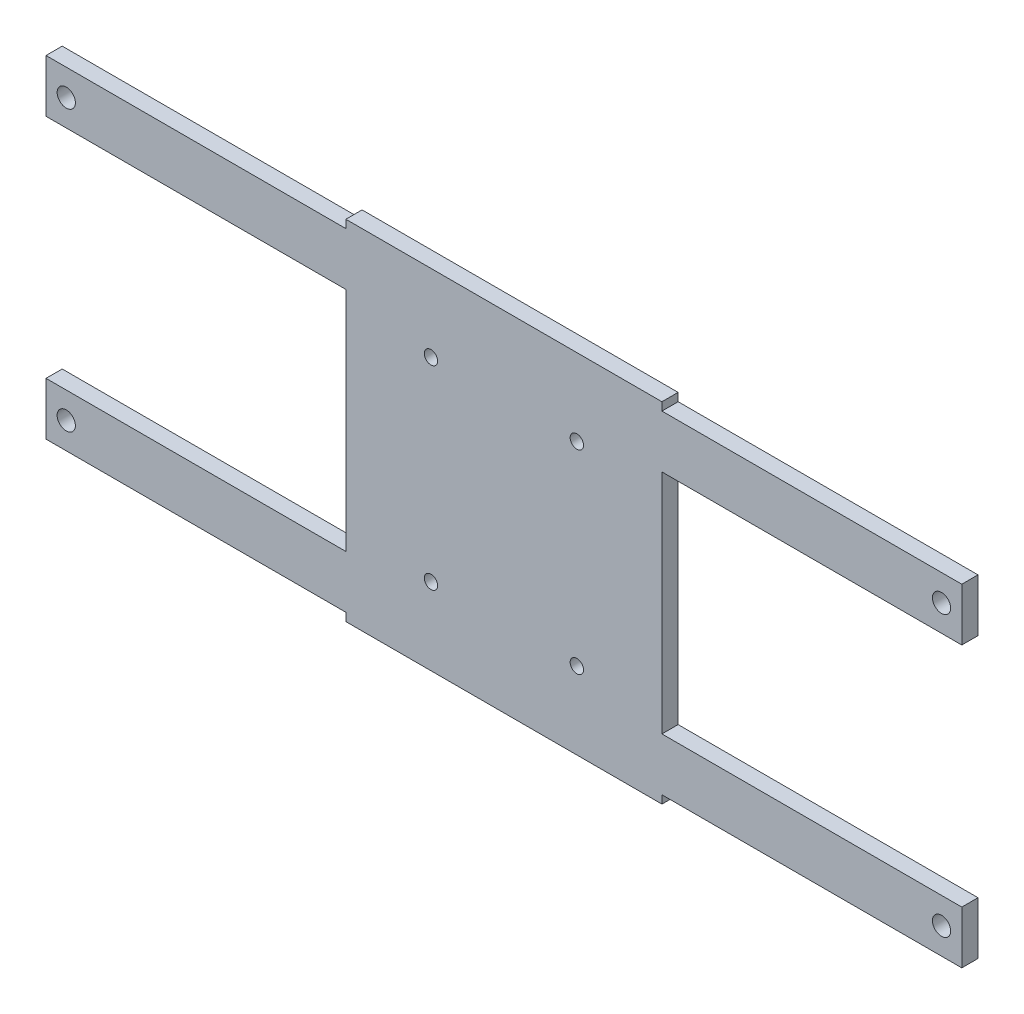
ISO-10303-21;
HEADER;
FILE_DESCRIPTION(('STEP AP214'),'2;1');
FILE_NAME('part.step','',(''),(''),'','','');
FILE_SCHEMA(('AUTOMOTIVE_DESIGN { 1 0 10303 214 1 1 1 1 }'));
ENDSEC;
DATA;
#1=APPLICATION_CONTEXT('core data for automotive mechanical design processes');
#2=APPLICATION_PROTOCOL_DEFINITION('international standard','automotive_design',2000,#1);
#3=PRODUCT_CONTEXT('',#1,'mechanical');
#4=PRODUCT('Part','Part','',(#3));
#5=PRODUCT_RELATED_PRODUCT_CATEGORY('part','',(#4));
#6=PRODUCT_DEFINITION_FORMATION('','',#4);
#7=PRODUCT_DEFINITION_CONTEXT('part definition',#1,'design');
#8=PRODUCT_DEFINITION('design','',#6,#7);
#9=PRODUCT_DEFINITION_SHAPE('','',#8);
#10=(LENGTH_UNIT() NAMED_UNIT(*) SI_UNIT(.MILLI.,.METRE.));
#11=(NAMED_UNIT(*) PLANE_ANGLE_UNIT() SI_UNIT($,.RADIAN.));
#12=(NAMED_UNIT(*) SI_UNIT($,.STERADIAN.) SOLID_ANGLE_UNIT());
#13=UNCERTAINTY_MEASURE_WITH_UNIT(LENGTH_MEASURE(1.E-05),#10,'distance_accuracy_value','');
#14=(GEOMETRIC_REPRESENTATION_CONTEXT(3) GLOBAL_UNCERTAINTY_ASSIGNED_CONTEXT((#13)) GLOBAL_UNIT_ASSIGNED_CONTEXT((#10,
#11,#12)) REPRESENTATION_CONTEXT('',''));
#15=CARTESIAN_POINT('',(0.,0.,0.));
#16=DIRECTION('',(0.,0.,1.));
#17=DIRECTION('',(1.,0.,0.));
#18=AXIS2_PLACEMENT_3D('',#15,#16,#17);
#19=CARTESIAN_POINT('',(39.,-28.,4.));
#20=DIRECTION('',(0.,-1.,0.));
#21=DIRECTION('',(0.,0.,-1.));
#22=AXIS2_PLACEMENT_3D('',#19,#20,#21);
#23=PLANE('',#22);
#24=DIRECTION('',(-1.,0.,0.));
#25=VECTOR('',#24,1.);
#26=CARTESIAN_POINT('',(39.,-28.,0.));
#27=LINE('',#26,#25);
#28=CARTESIAN_POINT('',(113.,-28.,0.));
#29=VERTEX_POINT('',#28);
#30=CARTESIAN_POINT('',(39.,-28.,0.));
#31=VERTEX_POINT('',#30);
#32=EDGE_CURVE('E213',#29,#31,#27,.T.);
#33=ORIENTED_EDGE('',*,*,#32,.T.);
#34=DIRECTION('',(0.,0.,-1.));
#35=VECTOR('',#34,1.);
#36=CARTESIAN_POINT('',(39.,-28.,4.));
#37=LINE('',#36,#35);
#38=CARTESIAN_POINT('',(39.,-28.,4.));
#39=VERTEX_POINT('',#38);
#40=EDGE_CURVE('E11',#39,#31,#37,.T.);
#41=ORIENTED_EDGE('',*,*,#40,.F.);
#42=DIRECTION('',(-1.,0.,0.));
#43=VECTOR('',#42,1.);
#44=CARTESIAN_POINT('',(39.,-28.,4.));
#45=LINE('',#44,#43);
#46=CARTESIAN_POINT('',(113.,-28.,4.));
#47=VERTEX_POINT('',#46);
#48=EDGE_CURVE('E252',#47,#39,#45,.T.);
#49=ORIENTED_EDGE('',*,*,#48,.F.);
#50=DIRECTION('',(0.,0.,-1.));
#51=VECTOR('',#50,1.);
#52=CARTESIAN_POINT('',(113.,-28.,4.));
#53=LINE('',#52,#51);
#54=EDGE_CURVE('E209',#47,#29,#53,.T.);
#55=ORIENTED_EDGE('',*,*,#54,.T.);
#56=EDGE_LOOP('',(#33,#41,#49,#55));
#57=FACE_BOUND('',#56,.T.);
#58=ADVANCED_FACE('F43',(#57),#23,.F.);
#59=CARTESIAN_POINT('',(39.,28.,4.));
#60=DIRECTION('',(-1.,0.,0.));
#61=DIRECTION('',(0.,0.,1.));
#62=AXIS2_PLACEMENT_3D('',#59,#60,#61);
#63=PLANE('',#62);
#64=DIRECTION('',(0.,1.,0.));
#65=VECTOR('',#64,1.);
#66=CARTESIAN_POINT('',(39.,28.,0.));
#67=LINE('',#66,#65);
#68=CARTESIAN_POINT('',(39.,28.,0.));
#69=VERTEX_POINT('',#68);
#70=EDGE_CURVE('E216',#31,#69,#67,.T.);
#71=ORIENTED_EDGE('',*,*,#70,.T.);
#72=DIRECTION('',(0.,0.,-1.));
#73=VECTOR('',#72,1.);
#74=CARTESIAN_POINT('',(39.,28.,4.));
#75=LINE('',#74,#73);
#76=CARTESIAN_POINT('',(39.,28.,4.));
#77=VERTEX_POINT('',#76);
#78=EDGE_CURVE('E52',#77,#69,#75,.T.);
#79=ORIENTED_EDGE('',*,*,#78,.F.);
#80=DIRECTION('',(0.,1.,0.));
#81=VECTOR('',#80,1.);
#82=CARTESIAN_POINT('',(39.,28.,4.));
#83=LINE('',#82,#81);
#84=EDGE_CURVE('E140',#39,#77,#83,.T.);
#85=ORIENTED_EDGE('',*,*,#84,.F.);
#86=ORIENTED_EDGE('',*,*,#40,.T.);
#87=EDGE_LOOP('',(#71,#79,#85,#86));
#88=FACE_BOUND('',#87,.T.);
#89=ADVANCED_FACE('F405',(#88),#63,.F.);
#90=CARTESIAN_POINT('',(113.,28.,4.));
#91=DIRECTION('',(0.,1.,0.));
#92=DIRECTION('',(0.,0.,1.));
#93=AXIS2_PLACEMENT_3D('',#90,#91,#92);
#94=PLANE('',#93);
#95=DIRECTION('',(1.,0.,0.));
#96=VECTOR('',#95,1.);
#97=CARTESIAN_POINT('',(113.,28.,0.));
#98=LINE('',#97,#96);
#99=CARTESIAN_POINT('',(113.,28.,0.));
#100=VERTEX_POINT('',#99);
#101=EDGE_CURVE('E219',#69,#100,#98,.T.);
#102=ORIENTED_EDGE('',*,*,#101,.T.);
#103=DIRECTION('',(0.,0.,-1.));
#104=VECTOR('',#103,1.);
#105=CARTESIAN_POINT('',(113.,28.,4.));
#106=LINE('',#105,#104);
#107=CARTESIAN_POINT('',(113.,28.,4.));
#108=VERTEX_POINT('',#107);
#109=EDGE_CURVE('E295',#108,#100,#106,.T.);
#110=ORIENTED_EDGE('',*,*,#109,.F.);
#111=DIRECTION('',(1.,0.,0.));
#112=VECTOR('',#111,1.);
#113=CARTESIAN_POINT('',(113.,28.,4.));
#114=LINE('',#113,#112);
#115=EDGE_CURVE('E348',#77,#108,#114,.T.);
#116=ORIENTED_EDGE('',*,*,#115,.F.);
#117=ORIENTED_EDGE('',*,*,#78,.T.);
#118=EDGE_LOOP('',(#102,#110,#116,#117));
#119=FACE_BOUND('',#118,.T.);
#120=ADVANCED_FACE('F409',(#119),#94,.F.);
#121=CARTESIAN_POINT('',(113.,41.,4.));
#122=DIRECTION('',(-1.,0.,0.));
#123=DIRECTION('',(0.,0.,1.));
#124=AXIS2_PLACEMENT_3D('',#121,#122,#123);
#125=PLANE('',#124);
#126=DIRECTION('',(0.,1.,0.));
#127=VECTOR('',#126,1.);
#128=CARTESIAN_POINT('',(113.,41.,0.));
#129=LINE('',#128,#127);
#130=CARTESIAN_POINT('',(113.,41.,0.));
#131=VERTEX_POINT('',#130);
#132=EDGE_CURVE('E221',#100,#131,#129,.T.);
#133=ORIENTED_EDGE('',*,*,#132,.T.);
#134=DIRECTION('',(0.,0.,-1.));
#135=VECTOR('',#134,1.);
#136=CARTESIAN_POINT('',(113.,41.,4.));
#137=LINE('',#136,#135);
#138=CARTESIAN_POINT('',(113.,41.,4.));
#139=VERTEX_POINT('',#138);
#140=EDGE_CURVE('E292',#139,#131,#137,.T.);
#141=ORIENTED_EDGE('',*,*,#140,.F.);
#142=DIRECTION('',(0.,1.,0.));
#143=VECTOR('',#142,1.);
#144=CARTESIAN_POINT('',(113.,41.,4.));
#145=LINE('',#144,#143);
#146=EDGE_CURVE('E350',#108,#139,#145,.T.);
#147=ORIENTED_EDGE('',*,*,#146,.F.);
#148=ORIENTED_EDGE('',*,*,#109,.T.);
#149=EDGE_LOOP('',(#133,#141,#147,#148));
#150=FACE_BOUND('',#149,.T.);
#151=ADVANCED_FACE('F413',(#150),#125,.F.);
#152=CARTESIAN_POINT('',(39.,41.,4.));
#153=DIRECTION('',(0.,-1.,0.));
#154=DIRECTION('',(0.,0.,-1.));
#155=AXIS2_PLACEMENT_3D('',#152,#153,#154);
#156=PLANE('',#155);
#157=DIRECTION('',(-1.,0.,0.));
#158=VECTOR('',#157,1.);
#159=CARTESIAN_POINT('',(39.,41.,0.));
#160=LINE('',#159,#158);
#161=CARTESIAN_POINT('',(39.,41.,0.));
#162=VERTEX_POINT('',#161);
#163=EDGE_CURVE('E223',#131,#162,#160,.T.);
#164=ORIENTED_EDGE('',*,*,#163,.T.);
#165=DIRECTION('',(0.,0.,-1.));
#166=VECTOR('',#165,1.);
#167=CARTESIAN_POINT('',(39.,41.,4.));
#168=LINE('',#167,#166);
#169=CARTESIAN_POINT('',(39.,41.,4.));
#170=VERTEX_POINT('',#169);
#171=EDGE_CURVE('E289',#170,#162,#168,.T.);
#172=ORIENTED_EDGE('',*,*,#171,.F.);
#173=DIRECTION('',(-1.,0.,0.));
#174=VECTOR('',#173,1.);
#175=CARTESIAN_POINT('',(39.,41.,4.));
#176=LINE('',#175,#174);
#177=EDGE_CURVE('E352',#139,#170,#176,.T.);
#178=ORIENTED_EDGE('',*,*,#177,.F.);
#179=ORIENTED_EDGE('',*,*,#140,.T.);
#180=EDGE_LOOP('',(#164,#172,#178,#179));
#181=FACE_BOUND('',#180,.T.);
#182=ADVANCED_FACE('F419',(#181),#156,.F.);
#183=CARTESIAN_POINT('',(39.,43.,4.));
#184=DIRECTION('',(-1.,0.,0.));
#185=DIRECTION('',(0.,0.,1.));
#186=AXIS2_PLACEMENT_3D('',#183,#184,#185);
#187=PLANE('',#186);
#188=DIRECTION('',(0.,1.,0.));
#189=VECTOR('',#188,1.);
#190=CARTESIAN_POINT('',(39.,43.,0.));
#191=LINE('',#190,#189);
#192=CARTESIAN_POINT('',(39.,43.,0.));
#193=VERTEX_POINT('',#192);
#194=EDGE_CURVE('E225',#162,#193,#191,.T.);
#195=ORIENTED_EDGE('',*,*,#194,.T.);
#196=DIRECTION('',(0.,0.,-1.));
#197=VECTOR('',#196,1.);
#198=CARTESIAN_POINT('',(39.,43.,4.));
#199=LINE('',#198,#197);
#200=CARTESIAN_POINT('',(39.,43.,4.));
#201=VERTEX_POINT('',#200);
#202=EDGE_CURVE('E286',#201,#193,#199,.T.);
#203=ORIENTED_EDGE('',*,*,#202,.F.);
#204=DIRECTION('',(0.,1.,0.));
#205=VECTOR('',#204,1.);
#206=CARTESIAN_POINT('',(39.,43.,4.));
#207=LINE('',#206,#205);
#208=EDGE_CURVE('E354',#170,#201,#207,.T.);
#209=ORIENTED_EDGE('',*,*,#208,.F.);
#210=ORIENTED_EDGE('',*,*,#171,.T.);
#211=EDGE_LOOP('',(#195,#203,#209,#210));
#212=FACE_BOUND('',#211,.T.);
#213=ADVANCED_FACE('F423',(#212),#187,.F.);
#214=CARTESIAN_POINT('',(-39.,43.,4.));
#215=DIRECTION('',(0.,-1.,0.));
#216=DIRECTION('',(0.,0.,-1.));
#217=AXIS2_PLACEMENT_3D('',#214,#215,#216);
#218=PLANE('',#217);
#219=DIRECTION('',(-1.,0.,0.));
#220=VECTOR('',#219,1.);
#221=CARTESIAN_POINT('',(-39.,43.,0.));
#222=LINE('',#221,#220);
#223=CARTESIAN_POINT('',(-39.,43.,0.));
#224=VERTEX_POINT('',#223);
#225=EDGE_CURVE('E227',#193,#224,#222,.T.);
#226=ORIENTED_EDGE('',*,*,#225,.T.);
#227=DIRECTION('',(0.,0.,-1.));
#228=VECTOR('',#227,1.);
#229=CARTESIAN_POINT('',(-39.,43.,4.));
#230=LINE('',#229,#228);
#231=CARTESIAN_POINT('',(-39.,43.,4.));
#232=VERTEX_POINT('',#231);
#233=EDGE_CURVE('E283',#232,#224,#230,.T.);
#234=ORIENTED_EDGE('',*,*,#233,.F.);
#235=DIRECTION('',(-1.,0.,0.));
#236=VECTOR('',#235,1.);
#237=CARTESIAN_POINT('',(-39.,43.,4.));
#238=LINE('',#237,#236);
#239=EDGE_CURVE('E356',#201,#232,#238,.T.);
#240=ORIENTED_EDGE('',*,*,#239,.F.);
#241=ORIENTED_EDGE('',*,*,#202,.T.);
#242=EDGE_LOOP('',(#226,#234,#240,#241));
#243=FACE_BOUND('',#242,.T.);
#244=ADVANCED_FACE('F427',(#243),#218,.F.);
#245=CARTESIAN_POINT('',(-39.,41.,4.));
#246=DIRECTION('',(1.,0.,0.));
#247=DIRECTION('',(0.,0.,-1.));
#248=AXIS2_PLACEMENT_3D('',#245,#246,#247);
#249=PLANE('',#248);
#250=DIRECTION('',(0.,-1.,0.));
#251=VECTOR('',#250,1.);
#252=CARTESIAN_POINT('',(-39.,41.,0.));
#253=LINE('',#252,#251);
#254=CARTESIAN_POINT('',(-39.,41.,0.));
#255=VERTEX_POINT('',#254);
#256=EDGE_CURVE('E229',#224,#255,#253,.T.);
#257=ORIENTED_EDGE('',*,*,#256,.T.);
#258=DIRECTION('',(0.,0.,-1.));
#259=VECTOR('',#258,1.);
#260=CARTESIAN_POINT('',(-39.,41.,4.));
#261=LINE('',#260,#259);
#262=CARTESIAN_POINT('',(-39.,41.,4.));
#263=VERTEX_POINT('',#262);
#264=EDGE_CURVE('E280',#263,#255,#261,.T.);
#265=ORIENTED_EDGE('',*,*,#264,.F.);
#266=DIRECTION('',(0.,-1.,0.));
#267=VECTOR('',#266,1.);
#268=CARTESIAN_POINT('',(-39.,41.,4.));
#269=LINE('',#268,#267);
#270=EDGE_CURVE('E358',#232,#263,#269,.T.);
#271=ORIENTED_EDGE('',*,*,#270,.F.);
#272=ORIENTED_EDGE('',*,*,#233,.T.);
#273=EDGE_LOOP('',(#257,#265,#271,#272));
#274=FACE_BOUND('',#273,.T.);
#275=ADVANCED_FACE('F431',(#274),#249,.F.);
#276=CARTESIAN_POINT('',(-113.,41.,4.));
#277=DIRECTION('',(0.,-1.,0.));
#278=DIRECTION('',(0.,0.,-1.));
#279=AXIS2_PLACEMENT_3D('',#276,#277,#278);
#280=PLANE('',#279);
#281=DIRECTION('',(-1.,0.,0.));
#282=VECTOR('',#281,1.);
#283=CARTESIAN_POINT('',(-113.,41.,0.));
#284=LINE('',#283,#282);
#285=CARTESIAN_POINT('',(-113.,41.,0.));
#286=VERTEX_POINT('',#285);
#287=EDGE_CURVE('E231',#255,#286,#284,.T.);
#288=ORIENTED_EDGE('',*,*,#287,.T.);
#289=DIRECTION('',(0.,0.,-1.));
#290=VECTOR('',#289,1.);
#291=CARTESIAN_POINT('',(-113.,41.,4.));
#292=LINE('',#291,#290);
#293=CARTESIAN_POINT('',(-113.,41.,4.));
#294=VERTEX_POINT('',#293);
#295=EDGE_CURVE('E277',#294,#286,#292,.T.);
#296=ORIENTED_EDGE('',*,*,#295,.F.);
#297=DIRECTION('',(-1.,0.,0.));
#298=VECTOR('',#297,1.);
#299=CARTESIAN_POINT('',(-113.,41.,4.));
#300=LINE('',#299,#298);
#301=EDGE_CURVE('E360',#263,#294,#300,.T.);
#302=ORIENTED_EDGE('',*,*,#301,.F.);
#303=ORIENTED_EDGE('',*,*,#264,.T.);
#304=EDGE_LOOP('',(#288,#296,#302,#303));
#305=FACE_BOUND('',#304,.T.);
#306=ADVANCED_FACE('F435',(#305),#280,.F.);
#307=CARTESIAN_POINT('',(-113.,28.,4.));
#308=DIRECTION('',(1.,0.,0.));
#309=DIRECTION('',(0.,0.,-1.));
#310=AXIS2_PLACEMENT_3D('',#307,#308,#309);
#311=PLANE('',#310);
#312=DIRECTION('',(0.,-1.,0.));
#313=VECTOR('',#312,1.);
#314=CARTESIAN_POINT('',(-113.,28.,0.));
#315=LINE('',#314,#313);
#316=CARTESIAN_POINT('',(-113.,28.,0.));
#317=VERTEX_POINT('',#316);
#318=EDGE_CURVE('E233',#286,#317,#315,.T.);
#319=ORIENTED_EDGE('',*,*,#318,.T.);
#320=DIRECTION('',(0.,0.,-1.));
#321=VECTOR('',#320,1.);
#322=CARTESIAN_POINT('',(-113.,28.,4.));
#323=LINE('',#322,#321);
#324=CARTESIAN_POINT('',(-113.,28.,4.));
#325=VERTEX_POINT('',#324);
#326=EDGE_CURVE('E274',#325,#317,#323,.T.);
#327=ORIENTED_EDGE('',*,*,#326,.F.);
#328=DIRECTION('',(0.,-1.,0.));
#329=VECTOR('',#328,1.);
#330=CARTESIAN_POINT('',(-113.,28.,4.));
#331=LINE('',#330,#329);
#332=EDGE_CURVE('E362',#294,#325,#331,.T.);
#333=ORIENTED_EDGE('',*,*,#332,.F.);
#334=ORIENTED_EDGE('',*,*,#295,.T.);
#335=EDGE_LOOP('',(#319,#327,#333,#334));
#336=FACE_BOUND('',#335,.T.);
#337=ADVANCED_FACE('F439',(#336),#311,.F.);
#338=CARTESIAN_POINT('',(-39.,28.,4.));
#339=DIRECTION('',(0.,1.,0.));
#340=DIRECTION('',(0.,0.,1.));
#341=AXIS2_PLACEMENT_3D('',#338,#339,#340);
#342=PLANE('',#341);
#343=DIRECTION('',(1.,0.,0.));
#344=VECTOR('',#343,1.);
#345=CARTESIAN_POINT('',(-39.,28.,0.));
#346=LINE('',#345,#344);
#347=CARTESIAN_POINT('',(-39.,28.,0.));
#348=VERTEX_POINT('',#347);
#349=EDGE_CURVE('E235',#317,#348,#346,.T.);
#350=ORIENTED_EDGE('',*,*,#349,.T.);
#351=DIRECTION('',(0.,0.,-1.));
#352=VECTOR('',#351,1.);
#353=CARTESIAN_POINT('',(-39.,28.,4.));
#354=LINE('',#353,#352);
#355=CARTESIAN_POINT('',(-39.,28.,4.));
#356=VERTEX_POINT('',#355);
#357=EDGE_CURVE('E271',#356,#348,#354,.T.);
#358=ORIENTED_EDGE('',*,*,#357,.F.);
#359=DIRECTION('',(1.,0.,0.));
#360=VECTOR('',#359,1.);
#361=CARTESIAN_POINT('',(-39.,28.,4.));
#362=LINE('',#361,#360);
#363=EDGE_CURVE('E364',#325,#356,#362,.T.);
#364=ORIENTED_EDGE('',*,*,#363,.F.);
#365=ORIENTED_EDGE('',*,*,#326,.T.);
#366=EDGE_LOOP('',(#350,#358,#364,#365));
#367=FACE_BOUND('',#366,.T.);
#368=ADVANCED_FACE('F443',(#367),#342,.F.);
#369=CARTESIAN_POINT('',(-39.,-28.,4.));
#370=DIRECTION('',(1.,0.,0.));
#371=DIRECTION('',(0.,0.,-1.));
#372=AXIS2_PLACEMENT_3D('',#369,#370,#371);
#373=PLANE('',#372);
#374=DIRECTION('',(0.,-1.,0.));
#375=VECTOR('',#374,1.);
#376=CARTESIAN_POINT('',(-39.,-28.,0.));
#377=LINE('',#376,#375);
#378=CARTESIAN_POINT('',(-39.,-28.,0.));
#379=VERTEX_POINT('',#378);
#380=EDGE_CURVE('E237',#348,#379,#377,.T.);
#381=ORIENTED_EDGE('',*,*,#380,.T.);
#382=DIRECTION('',(0.,0.,-1.));
#383=VECTOR('',#382,1.);
#384=CARTESIAN_POINT('',(-39.,-28.,4.));
#385=LINE('',#384,#383);
#386=CARTESIAN_POINT('',(-39.,-28.,4.));
#387=VERTEX_POINT('',#386);
#388=EDGE_CURVE('E268',#387,#379,#385,.T.);
#389=ORIENTED_EDGE('',*,*,#388,.F.);
#390=DIRECTION('',(0.,-1.,0.));
#391=VECTOR('',#390,1.);
#392=CARTESIAN_POINT('',(-39.,-28.,4.));
#393=LINE('',#392,#391);
#394=EDGE_CURVE('E366',#356,#387,#393,.T.);
#395=ORIENTED_EDGE('',*,*,#394,.F.);
#396=ORIENTED_EDGE('',*,*,#357,.T.);
#397=EDGE_LOOP('',(#381,#389,#395,#396));
#398=FACE_BOUND('',#397,.T.);
#399=ADVANCED_FACE('F447',(#398),#373,.F.);
#400=CARTESIAN_POINT('',(-113.,-28.,4.));
#401=DIRECTION('',(0.,-1.,0.));
#402=DIRECTION('',(0.,0.,-1.));
#403=AXIS2_PLACEMENT_3D('',#400,#401,#402);
#404=PLANE('',#403);
#405=DIRECTION('',(-1.,0.,0.));
#406=VECTOR('',#405,1.);
#407=CARTESIAN_POINT('',(-113.,-28.,0.));
#408=LINE('',#407,#406);
#409=CARTESIAN_POINT('',(-113.,-28.,0.));
#410=VERTEX_POINT('',#409);
#411=EDGE_CURVE('E239',#379,#410,#408,.T.);
#412=ORIENTED_EDGE('',*,*,#411,.T.);
#413=DIRECTION('',(0.,0.,-1.));
#414=VECTOR('',#413,1.);
#415=CARTESIAN_POINT('',(-113.,-28.,4.));
#416=LINE('',#415,#414);
#417=CARTESIAN_POINT('',(-113.,-28.,4.));
#418=VERTEX_POINT('',#417);
#419=EDGE_CURVE('E265',#418,#410,#416,.T.);
#420=ORIENTED_EDGE('',*,*,#419,.F.);
#421=DIRECTION('',(-1.,0.,0.));
#422=VECTOR('',#421,1.);
#423=CARTESIAN_POINT('',(-113.,-28.,4.));
#424=LINE('',#423,#422);
#425=EDGE_CURVE('E368',#387,#418,#424,.T.);
#426=ORIENTED_EDGE('',*,*,#425,.F.);
#427=ORIENTED_EDGE('',*,*,#388,.T.);
#428=EDGE_LOOP('',(#412,#420,#426,#427));
#429=FACE_BOUND('',#428,.T.);
#430=ADVANCED_FACE('F451',(#429),#404,.F.);
#431=CARTESIAN_POINT('',(-113.,-41.,4.));
#432=DIRECTION('',(1.,0.,0.));
#433=DIRECTION('',(0.,0.,-1.));
#434=AXIS2_PLACEMENT_3D('',#431,#432,#433);
#435=PLANE('',#434);
#436=DIRECTION('',(0.,-1.,0.));
#437=VECTOR('',#436,1.);
#438=CARTESIAN_POINT('',(-113.,-41.,0.));
#439=LINE('',#438,#437);
#440=CARTESIAN_POINT('',(-113.,-41.,0.));
#441=VERTEX_POINT('',#440);
#442=EDGE_CURVE('E241',#410,#441,#439,.T.);
#443=ORIENTED_EDGE('',*,*,#442,.T.);
#444=DIRECTION('',(0.,0.,-1.));
#445=VECTOR('',#444,1.);
#446=CARTESIAN_POINT('',(-113.,-41.,4.));
#447=LINE('',#446,#445);
#448=CARTESIAN_POINT('',(-113.,-41.,4.));
#449=VERTEX_POINT('',#448);
#450=EDGE_CURVE('E262',#449,#441,#447,.T.);
#451=ORIENTED_EDGE('',*,*,#450,.F.);
#452=DIRECTION('',(0.,-1.,0.));
#453=VECTOR('',#452,1.);
#454=CARTESIAN_POINT('',(-113.,-41.,4.));
#455=LINE('',#454,#453);
#456=EDGE_CURVE('E370',#418,#449,#455,.T.);
#457=ORIENTED_EDGE('',*,*,#456,.F.);
#458=ORIENTED_EDGE('',*,*,#419,.T.);
#459=EDGE_LOOP('',(#443,#451,#457,#458));
#460=FACE_BOUND('',#459,.T.);
#461=ADVANCED_FACE('F455',(#460),#435,.F.);
#462=CARTESIAN_POINT('',(-39.,-41.,4.));
#463=DIRECTION('',(0.,1.,0.));
#464=DIRECTION('',(0.,0.,1.));
#465=AXIS2_PLACEMENT_3D('',#462,#463,#464);
#466=PLANE('',#465);
#467=DIRECTION('',(1.,0.,0.));
#468=VECTOR('',#467,1.);
#469=CARTESIAN_POINT('',(-39.,-41.,0.));
#470=LINE('',#469,#468);
#471=CARTESIAN_POINT('',(-39.,-41.,0.));
#472=VERTEX_POINT('',#471);
#473=EDGE_CURVE('E243',#441,#472,#470,.T.);
#474=ORIENTED_EDGE('',*,*,#473,.T.);
#475=DIRECTION('',(0.,0.,-1.));
#476=VECTOR('',#475,1.);
#477=CARTESIAN_POINT('',(-39.,-41.,4.));
#478=LINE('',#477,#476);
#479=CARTESIAN_POINT('',(-39.,-41.,4.));
#480=VERTEX_POINT('',#479);
#481=EDGE_CURVE('E259',#480,#472,#478,.T.);
#482=ORIENTED_EDGE('',*,*,#481,.F.);
#483=DIRECTION('',(1.,0.,0.));
#484=VECTOR('',#483,1.);
#485=CARTESIAN_POINT('',(-39.,-41.,4.));
#486=LINE('',#485,#484);
#487=EDGE_CURVE('E372',#449,#480,#486,.T.);
#488=ORIENTED_EDGE('',*,*,#487,.F.);
#489=ORIENTED_EDGE('',*,*,#450,.T.);
#490=EDGE_LOOP('',(#474,#482,#488,#489));
#491=FACE_BOUND('',#490,.T.);
#492=ADVANCED_FACE('F459',(#491),#466,.F.);
#493=CARTESIAN_POINT('',(-39.,-43.,4.));
#494=DIRECTION('',(1.,0.,0.));
#495=DIRECTION('',(0.,0.,-1.));
#496=AXIS2_PLACEMENT_3D('',#493,#494,#495);
#497=PLANE('',#496);
#498=DIRECTION('',(0.,-1.,0.));
#499=VECTOR('',#498,1.);
#500=CARTESIAN_POINT('',(-39.,-43.,0.));
#501=LINE('',#500,#499);
#502=CARTESIAN_POINT('',(-39.,-43.,0.));
#503=VERTEX_POINT('',#502);
#504=EDGE_CURVE('E245',#472,#503,#501,.T.);
#505=ORIENTED_EDGE('',*,*,#504,.T.);
#506=DIRECTION('',(0.,0.,-1.));
#507=VECTOR('',#506,1.);
#508=CARTESIAN_POINT('',(-39.,-43.,4.));
#509=LINE('',#508,#507);
#510=CARTESIAN_POINT('',(-39.,-43.,4.));
#511=VERTEX_POINT('',#510);
#512=EDGE_CURVE('E256',#511,#503,#509,.T.);
#513=ORIENTED_EDGE('',*,*,#512,.F.);
#514=DIRECTION('',(0.,-1.,0.));
#515=VECTOR('',#514,1.);
#516=CARTESIAN_POINT('',(-39.,-43.,4.));
#517=LINE('',#516,#515);
#518=EDGE_CURVE('E374',#480,#511,#517,.T.);
#519=ORIENTED_EDGE('',*,*,#518,.F.);
#520=ORIENTED_EDGE('',*,*,#481,.T.);
#521=EDGE_LOOP('',(#505,#513,#519,#520));
#522=FACE_BOUND('',#521,.T.);
#523=ADVANCED_FACE('F380',(#522),#497,.F.);
#524=CARTESIAN_POINT('',(39.,-43.,4.));
#525=DIRECTION('',(0.,1.,0.));
#526=DIRECTION('',(0.,0.,1.));
#527=AXIS2_PLACEMENT_3D('',#524,#525,#526);
#528=PLANE('',#527);
#529=DIRECTION('',(1.,0.,0.));
#530=VECTOR('',#529,1.);
#531=CARTESIAN_POINT('',(39.,-43.,0.));
#532=LINE('',#531,#530);
#533=CARTESIAN_POINT('',(39.,-43.,0.));
#534=VERTEX_POINT('',#533);
#535=EDGE_CURVE('E247',#503,#534,#532,.T.);
#536=ORIENTED_EDGE('',*,*,#535,.T.);
#537=DIRECTION('',(0.,0.,-1.));
#538=VECTOR('',#537,1.);
#539=CARTESIAN_POINT('',(39.,-43.,4.));
#540=LINE('',#539,#538);
#541=CARTESIAN_POINT('',(39.,-43.,4.));
#542=VERTEX_POINT('',#541);
#543=EDGE_CURVE('E204',#542,#534,#540,.T.);
#544=ORIENTED_EDGE('',*,*,#543,.F.);
#545=DIRECTION('',(1.,0.,0.));
#546=VECTOR('',#545,1.);
#547=CARTESIAN_POINT('',(39.,-43.,4.));
#548=LINE('',#547,#546);
#549=EDGE_CURVE('E195',#511,#542,#548,.T.);
#550=ORIENTED_EDGE('',*,*,#549,.F.);
#551=ORIENTED_EDGE('',*,*,#512,.T.);
#552=EDGE_LOOP('',(#536,#544,#550,#551));
#553=FACE_BOUND('',#552,.T.);
#554=ADVANCED_FACE('F384',(#553),#528,.F.);
#555=CARTESIAN_POINT('',(39.,-41.,4.));
#556=DIRECTION('',(-1.,0.,0.));
#557=DIRECTION('',(0.,0.,1.));
#558=AXIS2_PLACEMENT_3D('',#555,#556,#557);
#559=PLANE('',#558);
#560=DIRECTION('',(0.,1.,0.));
#561=VECTOR('',#560,1.);
#562=CARTESIAN_POINT('',(39.,-41.,0.));
#563=LINE('',#562,#561);
#564=CARTESIAN_POINT('',(39.,-41.,0.));
#565=VERTEX_POINT('',#564);
#566=EDGE_CURVE('E203',#534,#565,#563,.T.);
#567=ORIENTED_EDGE('',*,*,#566,.T.);
#568=DIRECTION('',(0.,0.,-1.));
#569=VECTOR('',#568,1.);
#570=CARTESIAN_POINT('',(39.,-41.,4.));
#571=LINE('',#570,#569);
#572=CARTESIAN_POINT('',(39.,-41.,4.));
#573=VERTEX_POINT('',#572);
#574=EDGE_CURVE('E200',#573,#565,#571,.T.);
#575=ORIENTED_EDGE('',*,*,#574,.F.);
#576=DIRECTION('',(0.,1.,0.));
#577=VECTOR('',#576,1.);
#578=CARTESIAN_POINT('',(39.,-41.,4.));
#579=LINE('',#578,#577);
#580=EDGE_CURVE('E189',#542,#573,#579,.T.);
#581=ORIENTED_EDGE('',*,*,#580,.F.);
#582=ORIENTED_EDGE('',*,*,#543,.T.);
#583=EDGE_LOOP('',(#567,#575,#581,#582));
#584=FACE_BOUND('',#583,.T.);
#585=ADVANCED_FACE('F201',(#584),#559,.F.);
#586=CARTESIAN_POINT('',(113.,-41.,4.));
#587=DIRECTION('',(0.,1.,0.));
#588=DIRECTION('',(0.,0.,1.));
#589=AXIS2_PLACEMENT_3D('',#586,#587,#588);
#590=PLANE('',#589);
#591=DIRECTION('',(1.,0.,0.));
#592=VECTOR('',#591,1.);
#593=CARTESIAN_POINT('',(113.,-41.,0.));
#594=LINE('',#593,#592);
#595=CARTESIAN_POINT('',(113.,-41.,0.));
#596=VERTEX_POINT('',#595);
#597=EDGE_CURVE('E126',#565,#596,#594,.T.);
#598=ORIENTED_EDGE('',*,*,#597,.T.);
#599=DIRECTION('',(0.,0.,-1.));
#600=VECTOR('',#599,1.);
#601=CARTESIAN_POINT('',(113.,-41.,4.));
#602=LINE('',#601,#600);
#603=CARTESIAN_POINT('',(113.,-41.,4.));
#604=VERTEX_POINT('',#603);
#605=EDGE_CURVE('E205',#604,#596,#602,.T.);
#606=ORIENTED_EDGE('',*,*,#605,.F.);
#607=DIRECTION('',(1.,0.,0.));
#608=VECTOR('',#607,1.);
#609=CARTESIAN_POINT('',(113.,-41.,4.));
#610=LINE('',#609,#608);
#611=EDGE_CURVE('E193',#573,#604,#610,.T.);
#612=ORIENTED_EDGE('',*,*,#611,.F.);
#613=ORIENTED_EDGE('',*,*,#574,.T.);
#614=EDGE_LOOP('',(#598,#606,#612,#613));
#615=FACE_BOUND('',#614,.T.);
#616=ADVANCED_FACE('F207',(#615),#590,.F.);
#617=CARTESIAN_POINT('',(113.,-28.,4.));
#618=DIRECTION('',(-1.,0.,0.));
#619=DIRECTION('',(0.,0.,1.));
#620=AXIS2_PLACEMENT_3D('',#617,#618,#619);
#621=PLANE('',#620);
#622=DIRECTION('',(0.,1.,0.));
#623=VECTOR('',#622,1.);
#624=CARTESIAN_POINT('',(113.,-28.,0.));
#625=LINE('',#624,#623);
#626=EDGE_CURVE('E132',#596,#29,#625,.T.);
#627=ORIENTED_EDGE('',*,*,#626,.T.);
#628=ORIENTED_EDGE('',*,*,#54,.F.);
#629=DIRECTION('',(0.,1.,0.));
#630=VECTOR('',#629,1.);
#631=CARTESIAN_POINT('',(113.,-28.,4.));
#632=LINE('',#631,#630);
#633=EDGE_CURVE('E61',#604,#47,#632,.T.);
#634=ORIENTED_EDGE('',*,*,#633,.F.);
#635=ORIENTED_EDGE('',*,*,#605,.T.);
#636=EDGE_LOOP('',(#627,#628,#634,#635));
#637=FACE_BOUND('',#636,.T.);
#638=ADVANCED_FACE('F392',(#637),#621,.F.);
#639=CARTESIAN_POINT('',(0.,0.,4.));
#640=DIRECTION('',(0.,0.,-1.));
#641=DIRECTION('',(-1.,0.,0.));
#642=AXIS2_PLACEMENT_3D('',#639,#640,#641);
#643=PLANE('',#642);
#644=CARTESIAN_POINT('',(-18.,24.,4.));
#645=DIRECTION('',(0.,0.,-1.));
#646=DIRECTION('',(-1.,0.,0.));
#647=AXIS2_PLACEMENT_3D('',#644,#645,#646);
#648=CIRCLE('',#647,1.65);
#649=CARTESIAN_POINT('',(-19.65,24.,4.));
#650=VERTEX_POINT('',#649);
#651=EDGE_CURVE('E304',#650,#650,#648,.F.);
#652=ORIENTED_EDGE('',*,*,#651,.F.);
#653=EDGE_LOOP('',(#652));
#654=FACE_BOUND('',#653,.T.);
#655=CARTESIAN_POINT('',(18.,-24.,4.));
#656=DIRECTION('',(0.,0.,-1.));
#657=DIRECTION('',(-1.,0.,0.));
#658=AXIS2_PLACEMENT_3D('',#655,#656,#657);
#659=CIRCLE('',#658,1.65);
#660=CARTESIAN_POINT('',(16.35,-24.,4.));
#661=VERTEX_POINT('',#660);
#662=EDGE_CURVE('E325',#661,#661,#659,.F.);
#663=ORIENTED_EDGE('',*,*,#662,.F.);
#664=EDGE_LOOP('',(#663));
#665=FACE_BOUND('',#664,.T.);
#666=CARTESIAN_POINT('',(18.,24.,4.));
#667=DIRECTION('',(0.,0.,-1.));
#668=DIRECTION('',(-1.,0.,0.));
#669=AXIS2_PLACEMENT_3D('',#666,#667,#668);
#670=CIRCLE('',#669,1.65);
#671=CARTESIAN_POINT('',(16.35,24.,4.));
#672=VERTEX_POINT('',#671);
#673=EDGE_CURVE('E322',#672,#672,#670,.F.);
#674=ORIENTED_EDGE('',*,*,#673,.F.);
#675=EDGE_LOOP('',(#674));
#676=FACE_BOUND('',#675,.T.);
#677=CARTESIAN_POINT('',(-18.,-24.,4.));
#678=DIRECTION('',(0.,0.,-1.));
#679=DIRECTION('',(-1.,0.,0.));
#680=AXIS2_PLACEMENT_3D('',#677,#678,#679);
#681=CIRCLE('',#680,1.65);
#682=CARTESIAN_POINT('',(-19.65,-24.,4.));
#683=VERTEX_POINT('',#682);
#684=EDGE_CURVE('E319',#683,#683,#681,.F.);
#685=ORIENTED_EDGE('',*,*,#684,.F.);
#686=EDGE_LOOP('',(#685));
#687=FACE_BOUND('',#686,.T.);
#688=CARTESIAN_POINT('',(-108.,34.5,4.));
#689=DIRECTION('',(0.,0.,-1.));
#690=DIRECTION('',(-1.,0.,0.));
#691=AXIS2_PLACEMENT_3D('',#688,#689,#690);
#692=CIRCLE('',#691,2.25);
#693=CARTESIAN_POINT('',(-110.25,34.5,4.));
#694=VERTEX_POINT('',#693);
#695=EDGE_CURVE('E217',#694,#694,#692,.F.);
#696=ORIENTED_EDGE('',*,*,#695,.F.);
#697=EDGE_LOOP('',(#696));
#698=FACE_BOUND('',#697,.T.);
#699=CARTESIAN_POINT('',(108.,-34.5,4.));
#700=DIRECTION('',(0.,0.,-1.));
#701=DIRECTION('',(-1.,0.,0.));
#702=AXIS2_PLACEMENT_3D('',#699,#700,#701);
#703=CIRCLE('',#702,2.25);
#704=CARTESIAN_POINT('',(105.75,-34.5,4.));
#705=VERTEX_POINT('',#704);
#706=EDGE_CURVE('E312',#705,#705,#703,.F.);
#707=ORIENTED_EDGE('',*,*,#706,.F.);
#708=EDGE_LOOP('',(#707));
#709=FACE_BOUND('',#708,.T.);
#710=CARTESIAN_POINT('',(108.,34.5,4.));
#711=DIRECTION('',(0.,0.,-1.));
#712=DIRECTION('',(-1.,0.,0.));
#713=AXIS2_PLACEMENT_3D('',#710,#711,#712);
#714=CIRCLE('',#713,2.25);
#715=CARTESIAN_POINT('',(105.75,34.5,4.));
#716=VERTEX_POINT('',#715);
#717=EDGE_CURVE('E308',#716,#716,#714,.F.);
#718=ORIENTED_EDGE('',*,*,#717,.F.);
#719=EDGE_LOOP('',(#718));
#720=FACE_BOUND('',#719,.T.);
#721=CARTESIAN_POINT('',(-108.,-34.5,4.));
#722=DIRECTION('',(0.,0.,-1.));
#723=DIRECTION('',(-1.,0.,0.));
#724=AXIS2_PLACEMENT_3D('',#721,#722,#723);
#725=CIRCLE('',#724,2.25);
#726=CARTESIAN_POINT('',(-110.25,-34.5,4.));
#727=VERTEX_POINT('',#726);
#728=EDGE_CURVE('E303',#727,#727,#725,.F.);
#729=ORIENTED_EDGE('',*,*,#728,.F.);
#730=EDGE_LOOP('',(#729));
#731=FACE_BOUND('',#730,.T.);
#732=ORIENTED_EDGE('',*,*,#48,.T.);
#733=ORIENTED_EDGE('',*,*,#84,.T.);
#734=ORIENTED_EDGE('',*,*,#115,.T.);
#735=ORIENTED_EDGE('',*,*,#146,.T.);
#736=ORIENTED_EDGE('',*,*,#177,.T.);
#737=ORIENTED_EDGE('',*,*,#208,.T.);
#738=ORIENTED_EDGE('',*,*,#239,.T.);
#739=ORIENTED_EDGE('',*,*,#270,.T.);
#740=ORIENTED_EDGE('',*,*,#301,.T.);
#741=ORIENTED_EDGE('',*,*,#332,.T.);
#742=ORIENTED_EDGE('',*,*,#363,.T.);
#743=ORIENTED_EDGE('',*,*,#394,.T.);
#744=ORIENTED_EDGE('',*,*,#425,.T.);
#745=ORIENTED_EDGE('',*,*,#456,.T.);
#746=ORIENTED_EDGE('',*,*,#487,.T.);
#747=ORIENTED_EDGE('',*,*,#518,.T.);
#748=ORIENTED_EDGE('',*,*,#549,.T.);
#749=ORIENTED_EDGE('',*,*,#580,.T.);
#750=ORIENTED_EDGE('',*,*,#611,.T.);
#751=ORIENTED_EDGE('',*,*,#633,.T.);
#752=EDGE_LOOP('',(#732,#733,#734,#735,#736,#737,#738,#739,#740,#741,#742,#743,#744,#745,#746,
#747,#748,#749,#750,#751));
#753=FACE_BOUND('',#752,.T.);
#754=ADVANCED_FACE('F191',(#654,#665,#676,#687,#698,#709,#720,#731,#753),#643,.F.);
#755=CARTESIAN_POINT('',(0.,0.,0.));
#756=DIRECTION('',(0.,0.,-1.));
#757=DIRECTION('',(-1.,0.,0.));
#758=AXIS2_PLACEMENT_3D('',#755,#756,#757);
#759=PLANE('',#758);
#760=CARTESIAN_POINT('',(-18.,24.,0.));
#761=DIRECTION('',(0.,0.,-1.));
#762=DIRECTION('',(-1.,0.,0.));
#763=AXIS2_PLACEMENT_3D('',#760,#761,#762);
#764=CIRCLE('',#763,1.65);
#765=CARTESIAN_POINT('',(-19.65,24.,0.));
#766=VERTEX_POINT('',#765);
#767=EDGE_CURVE('E46',#766,#766,#764,.F.);
#768=ORIENTED_EDGE('',*,*,#767,.T.);
#769=EDGE_LOOP('',(#768));
#770=FACE_BOUND('',#769,.T.);
#771=CARTESIAN_POINT('',(18.,-24.,0.));
#772=DIRECTION('',(0.,0.,-1.));
#773=DIRECTION('',(-1.,0.,0.));
#774=AXIS2_PLACEMENT_3D('',#771,#772,#773);
#775=CIRCLE('',#774,1.65);
#776=CARTESIAN_POINT('',(16.35,-24.,0.));
#777=VERTEX_POINT('',#776);
#778=EDGE_CURVE('E323',#777,#777,#775,.F.);
#779=ORIENTED_EDGE('',*,*,#778,.T.);
#780=EDGE_LOOP('',(#779));
#781=FACE_BOUND('',#780,.T.);
#782=CARTESIAN_POINT('',(18.,24.,0.));
#783=DIRECTION('',(0.,0.,-1.));
#784=DIRECTION('',(-1.,0.,0.));
#785=AXIS2_PLACEMENT_3D('',#782,#783,#784);
#786=CIRCLE('',#785,1.65);
#787=CARTESIAN_POINT('',(16.35,24.,0.));
#788=VERTEX_POINT('',#787);
#789=EDGE_CURVE('E320',#788,#788,#786,.F.);
#790=ORIENTED_EDGE('',*,*,#789,.T.);
#791=EDGE_LOOP('',(#790));
#792=FACE_BOUND('',#791,.T.);
#793=CARTESIAN_POINT('',(-18.,-24.,0.));
#794=DIRECTION('',(0.,0.,-1.));
#795=DIRECTION('',(-1.,0.,0.));
#796=AXIS2_PLACEMENT_3D('',#793,#794,#795);
#797=CIRCLE('',#796,1.65);
#798=CARTESIAN_POINT('',(-19.65,-24.,0.));
#799=VERTEX_POINT('',#798);
#800=EDGE_CURVE('E316',#799,#799,#797,.F.);
#801=ORIENTED_EDGE('',*,*,#800,.T.);
#802=EDGE_LOOP('',(#801));
#803=FACE_BOUND('',#802,.T.);
#804=CARTESIAN_POINT('',(-108.,34.5,0.));
#805=DIRECTION('',(0.,0.,-1.));
#806=DIRECTION('',(-1.,0.,0.));
#807=AXIS2_PLACEMENT_3D('',#804,#805,#806);
#808=CIRCLE('',#807,2.25);
#809=CARTESIAN_POINT('',(-110.25,34.5,0.));
#810=VERTEX_POINT('',#809);
#811=EDGE_CURVE('E313',#810,#810,#808,.F.);
#812=ORIENTED_EDGE('',*,*,#811,.T.);
#813=EDGE_LOOP('',(#812));
#814=FACE_BOUND('',#813,.T.);
#815=CARTESIAN_POINT('',(108.,-34.5,0.));
#816=DIRECTION('',(0.,0.,-1.));
#817=DIRECTION('',(-1.,0.,0.));
#818=AXIS2_PLACEMENT_3D('',#815,#816,#817);
#819=CIRCLE('',#818,2.25);
#820=CARTESIAN_POINT('',(105.75,-34.5,0.));
#821=VERTEX_POINT('',#820);
#822=EDGE_CURVE('E309',#821,#821,#819,.F.);
#823=ORIENTED_EDGE('',*,*,#822,.T.);
#824=EDGE_LOOP('',(#823));
#825=FACE_BOUND('',#824,.T.);
#826=CARTESIAN_POINT('',(108.,34.5,0.));
#827=DIRECTION('',(0.,0.,-1.));
#828=DIRECTION('',(-1.,0.,0.));
#829=AXIS2_PLACEMENT_3D('',#826,#827,#828);
#830=CIRCLE('',#829,2.25);
#831=CARTESIAN_POINT('',(105.75,34.5,0.));
#832=VERTEX_POINT('',#831);
#833=EDGE_CURVE('E305',#832,#832,#830,.F.);
#834=ORIENTED_EDGE('',*,*,#833,.T.);
#835=EDGE_LOOP('',(#834));
#836=FACE_BOUND('',#835,.T.);
#837=CARTESIAN_POINT('',(-108.,-34.5,0.));
#838=DIRECTION('',(0.,0.,-1.));
#839=DIRECTION('',(-1.,0.,0.));
#840=AXIS2_PLACEMENT_3D('',#837,#838,#839);
#841=CIRCLE('',#840,2.25);
#842=CARTESIAN_POINT('',(-110.25,-34.5,0.));
#843=VERTEX_POINT('',#842);
#844=EDGE_CURVE('E300',#843,#843,#841,.F.);
#845=ORIENTED_EDGE('',*,*,#844,.T.);
#846=EDGE_LOOP('',(#845));
#847=FACE_BOUND('',#846,.T.);
#848=ORIENTED_EDGE('',*,*,#32,.F.);
#849=ORIENTED_EDGE('',*,*,#626,.F.);
#850=ORIENTED_EDGE('',*,*,#597,.F.);
#851=ORIENTED_EDGE('',*,*,#566,.F.);
#852=ORIENTED_EDGE('',*,*,#535,.F.);
#853=ORIENTED_EDGE('',*,*,#504,.F.);
#854=ORIENTED_EDGE('',*,*,#473,.F.);
#855=ORIENTED_EDGE('',*,*,#442,.F.);
#856=ORIENTED_EDGE('',*,*,#411,.F.);
#857=ORIENTED_EDGE('',*,*,#380,.F.);
#858=ORIENTED_EDGE('',*,*,#349,.F.);
#859=ORIENTED_EDGE('',*,*,#318,.F.);
#860=ORIENTED_EDGE('',*,*,#287,.F.);
#861=ORIENTED_EDGE('',*,*,#256,.F.);
#862=ORIENTED_EDGE('',*,*,#225,.F.);
#863=ORIENTED_EDGE('',*,*,#194,.F.);
#864=ORIENTED_EDGE('',*,*,#163,.F.);
#865=ORIENTED_EDGE('',*,*,#132,.F.);
#866=ORIENTED_EDGE('',*,*,#101,.F.);
#867=ORIENTED_EDGE('',*,*,#70,.F.);
#868=EDGE_LOOP('',(#848,#849,#850,#851,#852,#853,#854,#855,#856,#857,#858,#859,#860,#861,#862,
#863,#864,#865,#866,#867));
#869=FACE_BOUND('',#868,.T.);
#870=ADVANCED_FACE('F387',(#770,#781,#792,#803,#814,#825,#836,#847,#869),#759,.T.);
#871=CARTESIAN_POINT('',(-108.,-34.5,5.));
#872=DIRECTION('',(0.,0.,-1.));
#873=DIRECTION('',(-1.,0.,0.));
#874=AXIS2_PLACEMENT_3D('',#871,#872,#873);
#875=CYLINDRICAL_SURFACE('',#874,2.25);
#876=ORIENTED_EDGE('',*,*,#844,.F.);
#877=EDGE_LOOP('',(#876));
#878=FACE_BOUND('',#877,.T.);
#879=ORIENTED_EDGE('',*,*,#728,.T.);
#880=EDGE_LOOP('',(#879));
#881=FACE_BOUND('',#880,.T.);
#882=ADVANCED_FACE('F499',(#878,#881),#875,.F.);
#883=CARTESIAN_POINT('',(108.,34.5,5.));
#884=DIRECTION('',(0.,0.,-1.));
#885=DIRECTION('',(-1.,0.,0.));
#886=AXIS2_PLACEMENT_3D('',#883,#884,#885);
#887=CYLINDRICAL_SURFACE('',#886,2.25);
#888=ORIENTED_EDGE('',*,*,#833,.F.);
#889=EDGE_LOOP('',(#888));
#890=FACE_BOUND('',#889,.T.);
#891=ORIENTED_EDGE('',*,*,#717,.T.);
#892=EDGE_LOOP('',(#891));
#893=FACE_BOUND('',#892,.T.);
#894=ADVANCED_FACE('F508',(#890,#893),#887,.F.);
#895=CARTESIAN_POINT('',(108.,-34.5,5.));
#896=DIRECTION('',(0.,0.,-1.));
#897=DIRECTION('',(-1.,0.,0.));
#898=AXIS2_PLACEMENT_3D('',#895,#896,#897);
#899=CYLINDRICAL_SURFACE('',#898,2.25);
#900=ORIENTED_EDGE('',*,*,#822,.F.);
#901=EDGE_LOOP('',(#900));
#902=FACE_BOUND('',#901,.T.);
#903=ORIENTED_EDGE('',*,*,#706,.T.);
#904=EDGE_LOOP('',(#903));
#905=FACE_BOUND('',#904,.T.);
#906=ADVANCED_FACE('F518',(#902,#905),#899,.F.);
#907=CARTESIAN_POINT('',(-108.,34.5,5.));
#908=DIRECTION('',(0.,0.,-1.));
#909=DIRECTION('',(-1.,0.,0.));
#910=AXIS2_PLACEMENT_3D('',#907,#908,#909);
#911=CYLINDRICAL_SURFACE('',#910,2.25);
#912=ORIENTED_EDGE('',*,*,#811,.F.);
#913=EDGE_LOOP('',(#912));
#914=FACE_BOUND('',#913,.T.);
#915=ORIENTED_EDGE('',*,*,#695,.T.);
#916=EDGE_LOOP('',(#915));
#917=FACE_BOUND('',#916,.T.);
#918=ADVANCED_FACE('F528',(#914,#917),#911,.F.);
#919=CARTESIAN_POINT('',(-18.,-24.,5.));
#920=DIRECTION('',(0.,0.,-1.));
#921=DIRECTION('',(-1.,0.,0.));
#922=AXIS2_PLACEMENT_3D('',#919,#920,#921);
#923=CYLINDRICAL_SURFACE('',#922,1.65);
#924=ORIENTED_EDGE('',*,*,#800,.F.);
#925=EDGE_LOOP('',(#924));
#926=FACE_BOUND('',#925,.T.);
#927=ORIENTED_EDGE('',*,*,#684,.T.);
#928=EDGE_LOOP('',(#927));
#929=FACE_BOUND('',#928,.T.);
#930=ADVANCED_FACE('F537',(#926,#929),#923,.F.);
#931=CARTESIAN_POINT('',(18.,24.,5.));
#932=DIRECTION('',(0.,0.,-1.));
#933=DIRECTION('',(-1.,0.,0.));
#934=AXIS2_PLACEMENT_3D('',#931,#932,#933);
#935=CYLINDRICAL_SURFACE('',#934,1.65);
#936=ORIENTED_EDGE('',*,*,#789,.F.);
#937=EDGE_LOOP('',(#936));
#938=FACE_BOUND('',#937,.T.);
#939=ORIENTED_EDGE('',*,*,#673,.T.);
#940=EDGE_LOOP('',(#939));
#941=FACE_BOUND('',#940,.T.);
#942=ADVANCED_FACE('F546',(#938,#941),#935,.F.);
#943=CARTESIAN_POINT('',(18.,-24.,5.));
#944=DIRECTION('',(0.,0.,-1.));
#945=DIRECTION('',(-1.,0.,0.));
#946=AXIS2_PLACEMENT_3D('',#943,#944,#945);
#947=CYLINDRICAL_SURFACE('',#946,1.65);
#948=ORIENTED_EDGE('',*,*,#778,.F.);
#949=EDGE_LOOP('',(#948));
#950=FACE_BOUND('',#949,.T.);
#951=ORIENTED_EDGE('',*,*,#662,.T.);
#952=EDGE_LOOP('',(#951));
#953=FACE_BOUND('',#952,.T.);
#954=ADVANCED_FACE('F556',(#950,#953),#947,.F.);
#955=CARTESIAN_POINT('',(-18.,24.,5.));
#956=DIRECTION('',(0.,0.,-1.));
#957=DIRECTION('',(-1.,0.,0.));
#958=AXIS2_PLACEMENT_3D('',#955,#956,#957);
#959=CYLINDRICAL_SURFACE('',#958,1.65);
#960=ORIENTED_EDGE('',*,*,#767,.F.);
#961=EDGE_LOOP('',(#960));
#962=FACE_BOUND('',#961,.T.);
#963=ORIENTED_EDGE('',*,*,#651,.T.);
#964=EDGE_LOOP('',(#963));
#965=FACE_BOUND('',#964,.T.);
#966=ADVANCED_FACE('F566',(#962,#965),#959,.F.);
#967=CLOSED_SHELL('',(#58,#89,#120,#151,#182,#213,#244,#275,#306,#337,#368,#399,#430,#461,#492,
#523,#554,#585,#616,#638,#754,#870,#882,#894,#906,#918,#930,#942,#954,#966));
#968=MANIFOLD_SOLID_BREP('B2',#967);
#969=ADVANCED_BREP_SHAPE_REPRESENTATION('',(#18,#968),#14);
#970=SHAPE_DEFINITION_REPRESENTATION(#9,#969);
ENDSEC;
END-ISO-10303-21;
